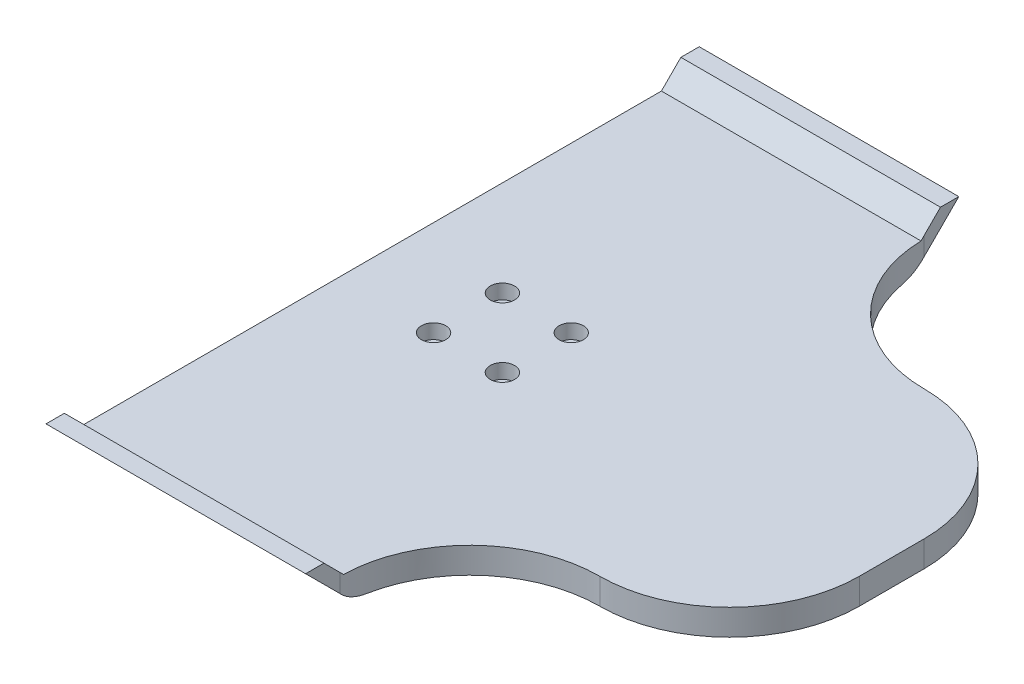
ISO-10303-21;
HEADER;
FILE_DESCRIPTION(('STEP AP214'),'2;1');
FILE_NAME('part.step','',(''),(''),'','','');
FILE_SCHEMA(('AUTOMOTIVE_DESIGN { 1 0 10303 214 1 1 1 1 }'));
ENDSEC;
DATA;
#1=APPLICATION_CONTEXT('core data for automotive mechanical design processes');
#2=APPLICATION_PROTOCOL_DEFINITION('international standard','automotive_design',2000,#1);
#3=PRODUCT_CONTEXT('',#1,'mechanical');
#4=PRODUCT('Part','Part','',(#3));
#5=PRODUCT_RELATED_PRODUCT_CATEGORY('part','',(#4));
#6=PRODUCT_DEFINITION_FORMATION('','',#4);
#7=PRODUCT_DEFINITION_CONTEXT('part definition',#1,'design');
#8=PRODUCT_DEFINITION('design','',#6,#7);
#9=PRODUCT_DEFINITION_SHAPE('','',#8);
#10=(LENGTH_UNIT() NAMED_UNIT(*) SI_UNIT(.MILLI.,.METRE.));
#11=(NAMED_UNIT(*) PLANE_ANGLE_UNIT() SI_UNIT($,.RADIAN.));
#12=(NAMED_UNIT(*) SI_UNIT($,.STERADIAN.) SOLID_ANGLE_UNIT());
#13=UNCERTAINTY_MEASURE_WITH_UNIT(LENGTH_MEASURE(1.E-05),#10,'distance_accuracy_value','');
#14=(GEOMETRIC_REPRESENTATION_CONTEXT(3) GLOBAL_UNCERTAINTY_ASSIGNED_CONTEXT((#13)) GLOBAL_UNIT_ASSIGNED_CONTEXT((#10,
#11,#12)) REPRESENTATION_CONTEXT('',''));
#15=CARTESIAN_POINT('',(0.,0.,0.));
#16=DIRECTION('',(0.,0.,1.));
#17=DIRECTION('',(1.,0.,0.));
#18=AXIS2_PLACEMENT_3D('',#15,#16,#17);
#19=CARTESIAN_POINT('',(40.,0.,0.));
#20=DIRECTION('',(1.,0.,0.));
#21=DIRECTION('',(0.,0.,-1.));
#22=AXIS2_PLACEMENT_3D('',#19,#20,#21);
#23=PLANE('',#22);
#24=DIRECTION('',(0.,0.,-1.));
#25=VECTOR('',#24,1.);
#26=CARTESIAN_POINT('',(40.,6.,107.156854249492));
#27=LINE('',#26,#25);
#28=CARTESIAN_POINT('',(40.,6.,100.656854249492));
#29=VERTEX_POINT('',#28);
#30=CARTESIAN_POINT('',(40.,6.,95.0000000000002));
#31=VERTEX_POINT('',#30);
#32=EDGE_CURVE('E266',#29,#31,#27,.T.);
#33=ORIENTED_EDGE('',*,*,#32,.F.);
#34=DIRECTION('',(0.,-0.707106781186548,-0.707106781186547));
#35=VECTOR('',#34,1.);
#36=CARTESIAN_POINT('',(40.,-47.3284271247462,47.3284271247463));
#37=LINE('',#36,#35);
#38=CARTESIAN_POINT('',(40.,-4.65685424949248,90.));
#39=VERTEX_POINT('',#38);
#40=EDGE_CURVE('E158',#29,#39,#37,.T.);
#41=ORIENTED_EDGE('',*,*,#40,.T.);
#42=DIRECTION('',(0.,-1.,0.));
#43=VECTOR('',#42,1.);
#44=CARTESIAN_POINT('',(40.,0.,90.));
#45=LINE('',#44,#43);
#46=CARTESIAN_POINT('',(40.,0.999999999999893,90.));
#47=VERTEX_POINT('',#46);
#48=EDGE_CURVE('E351',#39,#47,#45,.F.);
#49=ORIENTED_EDGE('',*,*,#48,.T.);
#50=DIRECTION('',(0.,0.707106781186544,0.707106781186551));
#51=VECTOR('',#50,1.);
#52=CARTESIAN_POINT('',(40.,0.,89.0000000000001));
#53=LINE('',#52,#51);
#54=EDGE_CURVE('E320',#47,#31,#53,.T.);
#55=ORIENTED_EDGE('',*,*,#54,.T.);
#56=EDGE_LOOP('',(#33,#41,#49,#55));
#57=FACE_BOUND('',#56,.T.);
#58=ADVANCED_FACE('F40',(#57),#23,.T.);
#59=CARTESIAN_POINT('',(40.,-8.,92.3137084989848));
#60=DIRECTION('',(0.,1.,0.));
#61=DIRECTION('',(0.,0.,1.));
#62=AXIS2_PLACEMENT_3D('',#59,#60,#61);
#63=PLANE('',#62);
#64=CARTESIAN_POINT('',(-10.6066017177982,-8.,-10.6066017177982));
#65=DIRECTION('',(0.,1.,0.));
#66=DIRECTION('',(0.,0.,1.));
#67=AXIS2_PLACEMENT_3D('',#64,#65,#66);
#68=CIRCLE('',#67,2.2);
#69=CARTESIAN_POINT('',(-10.6066017177982,-8.,-8.40660171779821));
#70=VERTEX_POINT('',#69);
#71=EDGE_CURVE('E300',#70,#70,#68,.T.);
#72=ORIENTED_EDGE('',*,*,#71,.T.);
#73=EDGE_LOOP('',(#72));
#74=FACE_BOUND('',#73,.T.);
#75=CARTESIAN_POINT('',(10.6066017177982,-8.,-10.6066017177982));
#76=DIRECTION('',(0.,1.,0.));
#77=DIRECTION('',(0.,0.,1.));
#78=AXIS2_PLACEMENT_3D('',#75,#76,#77);
#79=CIRCLE('',#78,2.2);
#80=CARTESIAN_POINT('',(10.6066017177982,-8.,-8.40660171779821));
#81=VERTEX_POINT('',#80);
#82=EDGE_CURVE('E297',#81,#81,#79,.T.);
#83=ORIENTED_EDGE('',*,*,#82,.T.);
#84=EDGE_LOOP('',(#83));
#85=FACE_BOUND('',#84,.T.);
#86=CARTESIAN_POINT('',(10.6066017177982,-8.,10.6066017177982));
#87=DIRECTION('',(0.,1.,0.));
#88=DIRECTION('',(0.,0.,1.));
#89=AXIS2_PLACEMENT_3D('',#86,#87,#88);
#90=CIRCLE('',#89,2.2);
#91=CARTESIAN_POINT('',(10.6066017177982,-8.,12.8066017177982));
#92=VERTEX_POINT('',#91);
#93=EDGE_CURVE('E301',#92,#92,#90,.T.);
#94=ORIENTED_EDGE('',*,*,#93,.T.);
#95=EDGE_LOOP('',(#94));
#96=FACE_BOUND('',#95,.T.);
#97=CARTESIAN_POINT('',(-10.6066017177982,-8.,10.6066017177982));
#98=DIRECTION('',(0.,1.,0.));
#99=DIRECTION('',(0.,0.,1.));
#100=AXIS2_PLACEMENT_3D('',#97,#98,#99);
#101=CIRCLE('',#100,2.2);
#102=CARTESIAN_POINT('',(-10.6066017177982,-8.,12.8066017177982));
#103=VERTEX_POINT('',#102);
#104=EDGE_CURVE('E304',#103,#103,#101,.T.);
#105=ORIENTED_EDGE('',*,*,#104,.T.);
#106=EDGE_LOOP('',(#105));
#107=FACE_BOUND('',#106,.T.);
#108=CARTESIAN_POINT('',(80.,-8.,90.));
#109=DIRECTION('',(0.,1.,0.));
#110=DIRECTION('',(0.,0.,1.));
#111=AXIS2_PLACEMENT_3D('',#108,#109,#110);
#112=CIRCLE('',#111,40.);
#113=CARTESIAN_POINT('',(80.,-8.,50.));
#114=VERTEX_POINT('',#113);
#115=CARTESIAN_POINT('',(40.7066091721715,-8.,82.5147186257615));
#116=VERTEX_POINT('',#115);
#117=EDGE_CURVE('E361',#114,#116,#112,.T.);
#118=ORIENTED_EDGE('',*,*,#117,.T.);
#119=DIRECTION('',(1.,0.,0.));
#120=VECTOR('',#119,1.);
#121=CARTESIAN_POINT('',(-40.,-8.,82.5147186257615));
#122=LINE('',#121,#120);
#123=CARTESIAN_POINT('',(-40.,-8.,82.5147186257615));
#124=VERTEX_POINT('',#123);
#125=EDGE_CURVE('E445',#116,#124,#122,.F.);
#126=ORIENTED_EDGE('',*,*,#125,.T.);
#127=DIRECTION('',(0.,0.,-1.));
#128=VECTOR('',#127,1.);
#129=CARTESIAN_POINT('',(-40.,-8.,92.3137084989848));
#130=LINE('',#129,#128);
#131=CARTESIAN_POINT('',(-40.,-8.,-82.5147186257615));
#132=VERTEX_POINT('',#131);
#133=EDGE_CURVE('E317',#124,#132,#130,.T.);
#134=ORIENTED_EDGE('',*,*,#133,.T.);
#135=DIRECTION('',(1.,0.,0.));
#136=VECTOR('',#135,1.);
#137=CARTESIAN_POINT('',(40.,-8.,-82.5147186257615));
#138=LINE('',#137,#136);
#139=CARTESIAN_POINT('',(40.7066091721715,-8.,-82.5147186257615));
#140=VERTEX_POINT('',#139);
#141=EDGE_CURVE('E194',#132,#140,#138,.T.);
#142=ORIENTED_EDGE('',*,*,#141,.T.);
#143=CARTESIAN_POINT('',(80.,-8.,-90.));
#144=DIRECTION('',(0.,1.,0.));
#145=DIRECTION('',(0.,0.,1.));
#146=AXIS2_PLACEMENT_3D('',#143,#144,#145);
#147=CIRCLE('',#146,40.);
#148=CARTESIAN_POINT('',(80.,-8.,-50.));
#149=VERTEX_POINT('',#148);
#150=EDGE_CURVE('E359',#140,#149,#147,.T.);
#151=ORIENTED_EDGE('',*,*,#150,.T.);
#152=CARTESIAN_POINT('',(80.,-8.,-9.99999999999999));
#153=DIRECTION('',(0.,1.,0.));
#154=DIRECTION('',(0.,0.,1.));
#155=AXIS2_PLACEMENT_3D('',#152,#153,#154);
#156=CIRCLE('',#155,40.);
#157=CARTESIAN_POINT('',(120.,-8.,-9.99999999999999));
#158=VERTEX_POINT('',#157);
#159=EDGE_CURVE('E348',#149,#158,#156,.F.);
#160=ORIENTED_EDGE('',*,*,#159,.T.);
#161=DIRECTION('',(0.,0.,-1.));
#162=VECTOR('',#161,1.);
#163=CARTESIAN_POINT('',(120.,-8.,-50.));
#164=LINE('',#163,#162);
#165=CARTESIAN_POINT('',(120.,-8.,10.));
#166=VERTEX_POINT('',#165);
#167=EDGE_CURVE('E310',#166,#158,#164,.T.);
#168=ORIENTED_EDGE('',*,*,#167,.F.);
#169=CARTESIAN_POINT('',(80.,-8.,10.));
#170=DIRECTION('',(0.,1.,0.));
#171=DIRECTION('',(0.,0.,1.));
#172=AXIS2_PLACEMENT_3D('',#169,#170,#171);
#173=CIRCLE('',#172,40.);
#174=EDGE_CURVE('E346',#166,#114,#173,.F.);
#175=ORIENTED_EDGE('',*,*,#174,.T.);
#176=EDGE_LOOP('',(#118,#126,#134,#142,#151,#160,#168,#175));
#177=FACE_BOUND('',#176,.T.);
#178=ADVANCED_FACE('F223',(#74,#85,#96,#107,#177),#63,.F.);
#179=CARTESIAN_POINT('',(-40.,0.,0.));
#180=DIRECTION('',(1.,0.,0.));
#181=DIRECTION('',(0.,0.,-1.));
#182=AXIS2_PLACEMENT_3D('',#179,#180,#181);
#183=PLANE('',#182);
#184=ORIENTED_EDGE('',*,*,#133,.F.);
#185=CARTESIAN_POINT('',(-40.,2.,82.5147186257615));
#186=DIRECTION('',(1.,0.,0.));
#187=DIRECTION('',(0.,0.,-1.));
#188=AXIS2_PLACEMENT_3D('',#185,#186,#187);
#189=CIRCLE('',#188,10.);
#190=CARTESIAN_POINT('',(-40.,-5.07106781186546,89.585786437627));
#191=VERTEX_POINT('',#190);
#192=EDGE_CURVE('E171',#124,#191,#189,.F.);
#193=ORIENTED_EDGE('',*,*,#192,.T.);
#194=DIRECTION('',(0.,-0.707106781186548,-0.707106781186547));
#195=VECTOR('',#194,1.);
#196=CARTESIAN_POINT('',(-40.,6.,100.656854249492));
#197=LINE('',#196,#195);
#198=CARTESIAN_POINT('',(-40.,6.,100.656854249492));
#199=VERTEX_POINT('',#198);
#200=EDGE_CURVE('E155',#199,#191,#197,.T.);
#201=ORIENTED_EDGE('',*,*,#200,.F.);
#202=DIRECTION('',(0.,0.,-1.));
#203=VECTOR('',#202,1.);
#204=CARTESIAN_POINT('',(-40.,6.,0.));
#205=LINE('',#204,#203);
#206=CARTESIAN_POINT('',(-40.,6.,95.0000000000002));
#207=VERTEX_POINT('',#206);
#208=EDGE_CURVE('E168',#199,#207,#205,.T.);
#209=ORIENTED_EDGE('',*,*,#208,.T.);
#210=DIRECTION('',(0.,0.707106781186544,0.707106781186551));
#211=VECTOR('',#210,1.);
#212=CARTESIAN_POINT('',(-40.,0.,89.0000000000001));
#213=LINE('',#212,#211);
#214=CARTESIAN_POINT('',(-40.,0.,89.0000000000001));
#215=VERTEX_POINT('',#214);
#216=EDGE_CURVE('E321',#215,#207,#213,.T.);
#217=ORIENTED_EDGE('',*,*,#216,.F.);
#218=DIRECTION('',(0.,0.,1.));
#219=VECTOR('',#218,1.);
#220=CARTESIAN_POINT('',(-40.,0.,89.0000000000001));
#221=LINE('',#220,#219);
#222=CARTESIAN_POINT('',(-40.,0.,-89.0000000000001));
#223=VERTEX_POINT('',#222);
#224=EDGE_CURVE('E329',#223,#215,#221,.T.);
#225=ORIENTED_EDGE('',*,*,#224,.F.);
#226=DIRECTION('',(0.,-0.707106781186549,0.707106781186546));
#227=VECTOR('',#226,1.);
#228=CARTESIAN_POINT('',(-40.,0.,-89.0000000000001));
#229=LINE('',#228,#227);
#230=CARTESIAN_POINT('',(-40.,6.,-95.0000000000001));
#231=VERTEX_POINT('',#230);
#232=EDGE_CURVE('E327',#231,#223,#229,.T.);
#233=ORIENTED_EDGE('',*,*,#232,.F.);
#234=CARTESIAN_POINT('',(-40.,6.,-100.656854249492));
#235=VERTEX_POINT('',#234);
#236=EDGE_CURVE('E178',#231,#235,#205,.T.);
#237=ORIENTED_EDGE('',*,*,#236,.T.);
#238=DIRECTION('',(0.,-0.707106781186548,0.707106781186547));
#239=VECTOR('',#238,1.);
#240=CARTESIAN_POINT('',(-40.,6.,-100.656854249492));
#241=LINE('',#240,#239);
#242=CARTESIAN_POINT('',(-40.,-5.07106781186546,-89.585786437627));
#243=VERTEX_POINT('',#242);
#244=EDGE_CURVE('E473',#235,#243,#241,.T.);
#245=ORIENTED_EDGE('',*,*,#244,.T.);
#246=CARTESIAN_POINT('',(-40.,2.,-82.5147186257615));
#247=DIRECTION('',(1.,0.,0.));
#248=DIRECTION('',(0.,0.,-1.));
#249=AXIS2_PLACEMENT_3D('',#246,#247,#248);
#250=CIRCLE('',#249,10.);
#251=EDGE_CURVE('E446',#243,#132,#250,.F.);
#252=ORIENTED_EDGE('',*,*,#251,.T.);
#253=EDGE_LOOP('',(#184,#193,#201,#209,#217,#225,#233,#237,#245,#252));
#254=FACE_BOUND('',#253,.T.);
#255=ADVANCED_FACE('F166',(#254),#183,.F.);
#256=CARTESIAN_POINT('',(80.,0.,90.));
#257=DIRECTION('',(0.,-1.,0.));
#258=DIRECTION('',(0.,0.,-1.));
#259=AXIS2_PLACEMENT_3D('',#256,#257,#258);
#260=CYLINDRICAL_SURFACE('',#259,40.);
#261=CARTESIAN_POINT('',(80.,-4.65685424949248,90.));
#262=DIRECTION('',(0.,-0.707106781186547,0.707106781186548));
#263=DIRECTION('',(0.,-0.707106781186548,-0.707106781186547));
#264=AXIS2_PLACEMENT_3D('',#261,#262,#263);
#265=ELLIPSE('',#264,56.5685424949238,40.);
#266=CARTESIAN_POINT('',(40.0021447184384,-5.07106781186546,89.585786437627));
#267=VERTEX_POINT('',#266);
#268=EDGE_CURVE('E162',#267,#39,#265,.F.);
#269=ORIENTED_EDGE('',*,*,#268,.F.);
#270=CARTESIAN_POINT('',(40.0021447184384,-5.07106781186546,89.585786437627));
#271=CARTESIAN_POINT('',(40.0041586859841,-5.26634212881536,89.3905574940038));
#272=CARTESIAN_POINT('',(40.0077012243591,-5.45347968856096,89.1872021111515));
#273=CARTESIAN_POINT('',(40.0184925640982,-5.8102756625916,88.7657707465181));
#274=CARTESIAN_POINT('',(40.0257415487148,-5.97993321213819,88.5476940373535));
#275=CARTESIAN_POINT('',(40.0445963198971,-6.3005692951608,88.0983364379006));
#276=CARTESIAN_POINT('',(40.0562027942129,-6.45154487502521,87.8670534681338));
#277=CARTESIAN_POINT('',(40.0843378978113,-6.73373285821434,87.3930352403398));
#278=CARTESIAN_POINT('',(40.1008661841382,-6.86494663759767,87.1503007812526));
#279=CARTESIAN_POINT('',(40.1393422947468,-7.10686861441198,86.6548903781081));
#280=CARTESIAN_POINT('',(40.1612962108379,-7.21755351613449,86.4022035296038));
#281=CARTESIAN_POINT('',(40.2109749097812,-7.41752213369764,85.8890486138794));
#282=CARTESIAN_POINT('',(40.2386996771802,-7.50680590684414,85.6285805674973));
#283=CARTESIAN_POINT('',(40.3001007104158,-7.66333417793151,85.102236279326));
#284=CARTESIAN_POINT('',(40.3337677878594,-7.73061225077905,84.8363689400022));
#285=CARTESIAN_POINT('',(40.4071542757666,-7.84298175184591,84.3009166341648));
#286=CARTESIAN_POINT('',(40.4468710784468,-7.88808270444527,84.0313333147768));
#287=CARTESIAN_POINT('',(40.5223237729934,-7.94809396068859,83.5535175972443));
#288=CARTESIAN_POINT('',(40.5568249669723,-7.96759401740613,83.3456526923086));
#289=CARTESIAN_POINT('',(40.6292029766075,-7.99354212480495,82.9299963827981));
#290=CARTESIAN_POINT('',(40.6670749957427,-8.00000842141069,82.7222052831815));
#291=CARTESIAN_POINT('',(40.7066091721715,-8.,82.5147186257615));
#292=B_SPLINE_CURVE_WITH_KNOTS('',3,(#270,#271,#272,#273,#274,#275,#276,#277,#278,#279,#280,
#281,#282,#283,#284,#285,#286,#287,#288,#289,#290,#291),.UNSPECIFIED.,.F.,.F.,(4,2,2,2,2,2,2,2,
2,2,4),(0.,0.828168374274392,1.65637769849803,2.48471779542649,3.31300018647703,
4.14221681865408,4.97143123041133,5.79937451276098,6.62696190811035,7.26137634256889,
7.89490204349188),.UNSPECIFIED.);
#293=EDGE_CURVE('E180',#267,#116,#292,.T.);
#294=ORIENTED_EDGE('',*,*,#293,.T.);
#295=ORIENTED_EDGE('',*,*,#117,.F.);
#296=DIRECTION('',(0.,-1.,0.));
#297=VECTOR('',#296,1.);
#298=CARTESIAN_POINT('',(80.,0.,50.));
#299=LINE('',#298,#297);
#300=CARTESIAN_POINT('',(80.,0.,50.));
#301=VERTEX_POINT('',#300);
#302=EDGE_CURVE('E309',#114,#301,#299,.F.);
#303=ORIENTED_EDGE('',*,*,#302,.T.);
#304=CARTESIAN_POINT('',(80.,0.,90.));
#305=DIRECTION('',(0.,-1.,0.));
#306=DIRECTION('',(0.,0.,-1.));
#307=AXIS2_PLACEMENT_3D('',#304,#305,#306);
#308=CIRCLE('',#307,40.);
#309=CARTESIAN_POINT('',(40.0125019537356,0.,89.0000000000001));
#310=VERTEX_POINT('',#309);
#311=EDGE_CURVE('E183',#310,#301,#308,.T.);
#312=ORIENTED_EDGE('',*,*,#311,.F.);
#313=CARTESIAN_POINT('',(80.,0.999999999999893,90.));
#314=DIRECTION('',(0.,-0.707106781186551,0.707106781186544));
#315=DIRECTION('',(0.,-0.707106781186544,-0.707106781186551));
#316=AXIS2_PLACEMENT_3D('',#313,#314,#315);
#317=ELLIPSE('',#316,56.5685424949235,40.);
#318=EDGE_CURVE('E364',#47,#310,#317,.T.);
#319=ORIENTED_EDGE('',*,*,#318,.F.);
#320=ORIENTED_EDGE('',*,*,#48,.F.);
#321=EDGE_LOOP('',(#269,#294,#295,#303,#312,#319,#320));
#322=FACE_BOUND('',#321,.T.);
#323=ADVANCED_FACE('F199',(#322),#260,.F.);
#324=CARTESIAN_POINT('',(0.,6.,0.));
#325=DIRECTION('',(0.,-1.,0.));
#326=DIRECTION('',(0.,0.,-1.));
#327=AXIS2_PLACEMENT_3D('',#324,#325,#326);
#328=PLANE('',#327);
#329=DIRECTION('',(1.,0.,0.));
#330=VECTOR('',#329,1.);
#331=CARTESIAN_POINT('',(-40.,6.,100.656854249492));
#332=LINE('',#331,#330);
#333=EDGE_CURVE('E151',#199,#29,#332,.T.);
#334=ORIENTED_EDGE('',*,*,#333,.T.);
#335=ORIENTED_EDGE('',*,*,#32,.T.);
#336=DIRECTION('',(1.,0.,0.));
#337=VECTOR('',#336,1.);
#338=CARTESIAN_POINT('',(40.,6.,95.0000000000002));
#339=LINE('',#338,#337);
#340=EDGE_CURVE('E175',#207,#31,#339,.T.);
#341=ORIENTED_EDGE('',*,*,#340,.F.);
#342=ORIENTED_EDGE('',*,*,#208,.F.);
#343=EDGE_LOOP('',(#334,#335,#341,#342));
#344=FACE_BOUND('',#343,.T.);
#345=ADVANCED_FACE('F173',(#344),#328,.F.);
#346=CARTESIAN_POINT('',(-10.6066017177982,-8.,-10.6066017177982));
#347=DIRECTION('',(0.,1.,0.));
#348=DIRECTION('',(0.,0.,1.));
#349=AXIS2_PLACEMENT_3D('',#346,#347,#348);
#350=CYLINDRICAL_SURFACE('',#349,2.2);
#351=ORIENTED_EDGE('',*,*,#71,.F.);
#352=EDGE_LOOP('',(#351));
#353=FACE_BOUND('',#352,.T.);
#354=CARTESIAN_POINT('',(-10.6066017177982,-4.5,-10.6066017177982));
#355=DIRECTION('',(0.,1.,0.));
#356=DIRECTION('',(0.,0.,1.));
#357=AXIS2_PLACEMENT_3D('',#354,#355,#356);
#358=CIRCLE('',#357,2.2);
#359=CARTESIAN_POINT('',(-10.6066017177982,-4.5,-8.40660171779821));
#360=VERTEX_POINT('',#359);
#361=EDGE_CURVE('E185',#360,#360,#358,.F.);
#362=ORIENTED_EDGE('',*,*,#361,.F.);
#363=EDGE_LOOP('',(#362));
#364=FACE_BOUND('',#363,.T.);
#365=ADVANCED_FACE('F385',(#353,#364),#350,.F.);
#366=CARTESIAN_POINT('',(10.6066017177982,-8.,-10.6066017177982));
#367=DIRECTION('',(0.,1.,0.));
#368=DIRECTION('',(0.,0.,1.));
#369=AXIS2_PLACEMENT_3D('',#366,#367,#368);
#370=CYLINDRICAL_SURFACE('',#369,2.2);
#371=ORIENTED_EDGE('',*,*,#82,.F.);
#372=EDGE_LOOP('',(#371));
#373=FACE_BOUND('',#372,.T.);
#374=CARTESIAN_POINT('',(10.6066017177982,-4.5,-10.6066017177982));
#375=DIRECTION('',(0.,1.,0.));
#376=DIRECTION('',(0.,0.,1.));
#377=AXIS2_PLACEMENT_3D('',#374,#375,#376);
#378=CIRCLE('',#377,2.2);
#379=CARTESIAN_POINT('',(10.6066017177982,-4.5,-8.40660171779821));
#380=VERTEX_POINT('',#379);
#381=EDGE_CURVE('E376',#380,#380,#378,.F.);
#382=ORIENTED_EDGE('',*,*,#381,.F.);
#383=EDGE_LOOP('',(#382));
#384=FACE_BOUND('',#383,.T.);
#385=ADVANCED_FACE('F386',(#373,#384),#370,.F.);
#386=CARTESIAN_POINT('',(10.6066017177982,-8.,10.6066017177982));
#387=DIRECTION('',(0.,1.,0.));
#388=DIRECTION('',(0.,0.,1.));
#389=AXIS2_PLACEMENT_3D('',#386,#387,#388);
#390=CYLINDRICAL_SURFACE('',#389,2.2);
#391=ORIENTED_EDGE('',*,*,#93,.F.);
#392=EDGE_LOOP('',(#391));
#393=FACE_BOUND('',#392,.T.);
#394=CARTESIAN_POINT('',(10.6066017177982,-4.5,10.6066017177982));
#395=DIRECTION('',(0.,1.,0.));
#396=DIRECTION('',(0.,0.,1.));
#397=AXIS2_PLACEMENT_3D('',#394,#395,#396);
#398=CIRCLE('',#397,2.2);
#399=CARTESIAN_POINT('',(10.6066017177982,-4.5,12.8066017177982));
#400=VERTEX_POINT('',#399);
#401=EDGE_CURVE('E374',#400,#400,#398,.F.);
#402=ORIENTED_EDGE('',*,*,#401,.F.);
#403=EDGE_LOOP('',(#402));
#404=FACE_BOUND('',#403,.T.);
#405=ADVANCED_FACE('F392',(#393,#404),#390,.F.);
#406=CARTESIAN_POINT('',(-10.6066017177982,-8.,10.6066017177982));
#407=DIRECTION('',(0.,1.,0.));
#408=DIRECTION('',(0.,0.,1.));
#409=AXIS2_PLACEMENT_3D('',#406,#407,#408);
#410=CYLINDRICAL_SURFACE('',#409,2.2);
#411=ORIENTED_EDGE('',*,*,#104,.F.);
#412=EDGE_LOOP('',(#411));
#413=FACE_BOUND('',#412,.T.);
#414=CARTESIAN_POINT('',(-10.6066017177982,-4.5,10.6066017177982));
#415=DIRECTION('',(0.,1.,0.));
#416=DIRECTION('',(0.,0.,1.));
#417=AXIS2_PLACEMENT_3D('',#414,#415,#416);
#418=CIRCLE('',#417,2.2);
#419=CARTESIAN_POINT('',(-10.6066017177982,-4.5,12.8066017177982));
#420=VERTEX_POINT('',#419);
#421=EDGE_CURVE('E294',#420,#420,#418,.F.);
#422=ORIENTED_EDGE('',*,*,#421,.F.);
#423=EDGE_LOOP('',(#422));
#424=FACE_BOUND('',#423,.T.);
#425=ADVANCED_FACE('F398',(#413,#424),#410,.F.);
#426=CARTESIAN_POINT('',(40.,0.,-89.0000000000001));
#427=DIRECTION('',(0.,-0.707106781186546,-0.707106781186549));
#428=DIRECTION('',(0.,0.707106781186549,-0.707106781186546));
#429=AXIS2_PLACEMENT_3D('',#426,#427,#428);
#430=PLANE('',#429);
#431=DIRECTION('',(0.,-0.707106781186549,0.707106781186546));
#432=VECTOR('',#431,1.);
#433=CARTESIAN_POINT('',(40.,0.,-89.0000000000001));
#434=LINE('',#433,#432);
#435=CARTESIAN_POINT('',(40.,6.,-95.0000000000001));
#436=VERTEX_POINT('',#435);
#437=CARTESIAN_POINT('',(40.,0.999999999999907,-90.));
#438=VERTEX_POINT('',#437);
#439=EDGE_CURVE('E318',#436,#438,#434,.T.);
#440=ORIENTED_EDGE('',*,*,#439,.F.);
#441=DIRECTION('',(-1.,0.,0.));
#442=VECTOR('',#441,1.);
#443=CARTESIAN_POINT('',(40.,6.,-95.0000000000001));
#444=LINE('',#443,#442);
#445=EDGE_CURVE('E265',#436,#231,#444,.T.);
#446=ORIENTED_EDGE('',*,*,#445,.T.);
#447=ORIENTED_EDGE('',*,*,#232,.T.);
#448=DIRECTION('',(-1.,0.,0.));
#449=VECTOR('',#448,1.);
#450=CARTESIAN_POINT('',(40.,0.,-89.0000000000001));
#451=LINE('',#450,#449);
#452=CARTESIAN_POINT('',(40.0125019537356,0.,-89.0000000000001));
#453=VERTEX_POINT('',#452);
#454=EDGE_CURVE('E334',#453,#223,#451,.T.);
#455=ORIENTED_EDGE('',*,*,#454,.F.);
#456=CARTESIAN_POINT('',(80.,0.999999999999907,-90.));
#457=DIRECTION('',(0.,-0.707106781186546,-0.707106781186549));
#458=DIRECTION('',(0.,0.707106781186549,-0.707106781186546));
#459=AXIS2_PLACEMENT_3D('',#456,#457,#458);
#460=ELLIPSE('',#459,56.5685424949239,40.);
#461=EDGE_CURVE('E356',#453,#438,#460,.T.);
#462=ORIENTED_EDGE('',*,*,#461,.T.);
#463=EDGE_LOOP('',(#440,#446,#447,#455,#462));
#464=FACE_BOUND('',#463,.T.);
#465=ADVANCED_FACE('F401',(#464),#430,.F.);
#466=CARTESIAN_POINT('',(40.,0.,89.0000000000001));
#467=DIRECTION('',(0.,-1.,0.));
#468=DIRECTION('',(0.,0.,-1.));
#469=AXIS2_PLACEMENT_3D('',#466,#467,#468);
#470=PLANE('',#469);
#471=CARTESIAN_POINT('',(-10.6066017177982,0.,10.6066017177982));
#472=DIRECTION('',(0.,1.,0.));
#473=DIRECTION('',(0.,0.,1.));
#474=AXIS2_PLACEMENT_3D('',#471,#472,#473);
#475=CIRCLE('',#474,3.75);
#476=CARTESIAN_POINT('',(-10.6066017177982,0.,14.3566017177982));
#477=VERTEX_POINT('',#476);
#478=EDGE_CURVE('E286',#477,#477,#475,.T.);
#479=ORIENTED_EDGE('',*,*,#478,.F.);
#480=EDGE_LOOP('',(#479));
#481=FACE_BOUND('',#480,.T.);
#482=CARTESIAN_POINT('',(10.6066017177982,0.,10.6066017177982));
#483=DIRECTION('',(0.,1.,0.));
#484=DIRECTION('',(0.,0.,1.));
#485=AXIS2_PLACEMENT_3D('',#482,#483,#484);
#486=CIRCLE('',#485,3.75);
#487=CARTESIAN_POINT('',(10.6066017177982,0.,14.3566017177982));
#488=VERTEX_POINT('',#487);
#489=EDGE_CURVE('E280',#488,#488,#486,.T.);
#490=ORIENTED_EDGE('',*,*,#489,.F.);
#491=EDGE_LOOP('',(#490));
#492=FACE_BOUND('',#491,.T.);
#493=CARTESIAN_POINT('',(10.6066017177982,0.,-10.6066017177982));
#494=DIRECTION('',(0.,1.,0.));
#495=DIRECTION('',(0.,0.,1.));
#496=AXIS2_PLACEMENT_3D('',#493,#494,#495);
#497=CIRCLE('',#496,3.75);
#498=CARTESIAN_POINT('',(10.6066017177982,0.,-6.85660171779821));
#499=VERTEX_POINT('',#498);
#500=EDGE_CURVE('E273',#499,#499,#497,.T.);
#501=ORIENTED_EDGE('',*,*,#500,.F.);
#502=EDGE_LOOP('',(#501));
#503=FACE_BOUND('',#502,.T.);
#504=CARTESIAN_POINT('',(-10.6066017177982,0.,-10.6066017177982));
#505=DIRECTION('',(0.,1.,0.));
#506=DIRECTION('',(0.,0.,1.));
#507=AXIS2_PLACEMENT_3D('',#504,#505,#506);
#508=CIRCLE('',#507,3.75);
#509=CARTESIAN_POINT('',(-10.6066017177982,0.,-6.85660171779821));
#510=VERTEX_POINT('',#509);
#511=EDGE_CURVE('E276',#510,#510,#508,.T.);
#512=ORIENTED_EDGE('',*,*,#511,.F.);
#513=EDGE_LOOP('',(#512));
#514=FACE_BOUND('',#513,.T.);
#515=DIRECTION('',(0.,0.,1.));
#516=VECTOR('',#515,1.);
#517=CARTESIAN_POINT('',(120.,0.,-50.));
#518=LINE('',#517,#516);
#519=CARTESIAN_POINT('',(120.,0.,-9.99999999999999));
#520=VERTEX_POINT('',#519);
#521=CARTESIAN_POINT('',(120.,0.,10.));
#522=VERTEX_POINT('',#521);
#523=EDGE_CURVE('E313',#520,#522,#518,.T.);
#524=ORIENTED_EDGE('',*,*,#523,.F.);
#525=CARTESIAN_POINT('',(80.,0.,-9.99999999999999));
#526=DIRECTION('',(0.,-1.,0.));
#527=DIRECTION('',(0.,0.,-1.));
#528=AXIS2_PLACEMENT_3D('',#525,#526,#527);
#529=CIRCLE('',#528,40.);
#530=CARTESIAN_POINT('',(80.,0.,-50.));
#531=VERTEX_POINT('',#530);
#532=EDGE_CURVE('E344',#520,#531,#529,.F.);
#533=ORIENTED_EDGE('',*,*,#532,.T.);
#534=CARTESIAN_POINT('',(80.,0.,-90.));
#535=DIRECTION('',(0.,-1.,0.));
#536=DIRECTION('',(0.,0.,-1.));
#537=AXIS2_PLACEMENT_3D('',#534,#535,#536);
#538=CIRCLE('',#537,40.);
#539=EDGE_CURVE('E353',#531,#453,#538,.T.);
#540=ORIENTED_EDGE('',*,*,#539,.T.);
#541=ORIENTED_EDGE('',*,*,#454,.T.);
#542=ORIENTED_EDGE('',*,*,#224,.T.);
#543=DIRECTION('',(-1.,0.,0.));
#544=VECTOR('',#543,1.);
#545=CARTESIAN_POINT('',(40.,0.,89.0000000000001));
#546=LINE('',#545,#544);
#547=EDGE_CURVE('E324',#310,#215,#546,.T.);
#548=ORIENTED_EDGE('',*,*,#547,.F.);
#549=ORIENTED_EDGE('',*,*,#311,.T.);
#550=CARTESIAN_POINT('',(80.,0.,10.));
#551=DIRECTION('',(0.,-1.,0.));
#552=DIRECTION('',(0.,0.,-1.));
#553=AXIS2_PLACEMENT_3D('',#550,#551,#552);
#554=CIRCLE('',#553,40.);
#555=EDGE_CURVE('E342',#301,#522,#554,.F.);
#556=ORIENTED_EDGE('',*,*,#555,.T.);
#557=EDGE_LOOP('',(#524,#533,#540,#541,#542,#548,#549,#556));
#558=FACE_BOUND('',#557,.T.);
#559=ADVANCED_FACE('F245',(#481,#492,#503,#514,#558),#470,.F.);
#560=CARTESIAN_POINT('',(40.,0.,89.0000000000001));
#561=DIRECTION('',(0.,-0.707106781186551,0.707106781186544));
#562=DIRECTION('',(0.,-0.707106781186544,-0.707106781186551));
#563=AXIS2_PLACEMENT_3D('',#560,#561,#562);
#564=PLANE('',#563);
#565=ORIENTED_EDGE('',*,*,#216,.T.);
#566=ORIENTED_EDGE('',*,*,#340,.T.);
#567=ORIENTED_EDGE('',*,*,#54,.F.);
#568=ORIENTED_EDGE('',*,*,#318,.T.);
#569=ORIENTED_EDGE('',*,*,#547,.T.);
#570=EDGE_LOOP('',(#565,#566,#567,#568,#569));
#571=FACE_BOUND('',#570,.T.);
#572=ADVANCED_FACE('F238',(#571),#564,.F.);
#573=DIRECTION('',(0.,-0.707106781186548,0.707106781186547));
#574=VECTOR('',#573,1.);
#575=CARTESIAN_POINT('',(40.,-47.3284271247462,-47.3284271247463));
#576=LINE('',#575,#574);
#577=CARTESIAN_POINT('',(40.,6.,-100.656854249492));
#578=VERTEX_POINT('',#577);
#579=CARTESIAN_POINT('',(40.,-4.65685424949249,-90.));
#580=VERTEX_POINT('',#579);
#581=EDGE_CURVE('E252',#578,#580,#576,.T.);
#582=ORIENTED_EDGE('',*,*,#581,.F.);
#583=EDGE_CURVE('E254',#436,#578,#27,.T.);
#584=ORIENTED_EDGE('',*,*,#583,.F.);
#585=ORIENTED_EDGE('',*,*,#439,.T.);
#586=DIRECTION('',(0.,1.,0.));
#587=VECTOR('',#586,1.);
#588=CARTESIAN_POINT('',(40.,0.,-90.));
#589=LINE('',#588,#587);
#590=EDGE_CURVE('E257',#438,#580,#589,.F.);
#591=ORIENTED_EDGE('',*,*,#590,.T.);
#592=EDGE_LOOP('',(#582,#584,#585,#591));
#593=FACE_BOUND('',#592,.T.);
#594=ADVANCED_FACE('F226',(#593),#23,.T.);
#595=CARTESIAN_POINT('',(120.,0.,0.));
#596=DIRECTION('',(-1.,0.,0.));
#597=DIRECTION('',(0.,0.,1.));
#598=AXIS2_PLACEMENT_3D('',#595,#596,#597);
#599=PLANE('',#598);
#600=ORIENTED_EDGE('',*,*,#167,.T.);
#601=DIRECTION('',(0.,1.,0.));
#602=VECTOR('',#601,1.);
#603=CARTESIAN_POINT('',(120.,0.,-9.99999999999999));
#604=LINE('',#603,#602);
#605=EDGE_CURVE('E339',#158,#520,#604,.T.);
#606=ORIENTED_EDGE('',*,*,#605,.T.);
#607=ORIENTED_EDGE('',*,*,#523,.T.);
#608=DIRECTION('',(0.,-1.,0.));
#609=VECTOR('',#608,1.);
#610=CARTESIAN_POINT('',(120.,0.,10.));
#611=LINE('',#610,#609);
#612=EDGE_CURVE('E337',#522,#166,#611,.T.);
#613=ORIENTED_EDGE('',*,*,#612,.T.);
#614=EDGE_LOOP('',(#600,#606,#607,#613));
#615=FACE_BOUND('',#614,.T.);
#616=ADVANCED_FACE('F237',(#615),#599,.F.);
#617=CARTESIAN_POINT('',(80.,0.,-90.));
#618=DIRECTION('',(0.,1.,0.));
#619=DIRECTION('',(0.,0.,1.));
#620=AXIS2_PLACEMENT_3D('',#617,#618,#619);
#621=CYLINDRICAL_SURFACE('',#620,40.);
#622=ORIENTED_EDGE('',*,*,#150,.F.);
#623=CARTESIAN_POINT('',(40.7066091721715,-8.,-82.5147186257615));
#624=CARTESIAN_POINT('',(40.6548329360915,-8.00003319694535,-82.7863668290822));
#625=CARTESIAN_POINT('',(40.6059242791889,-7.98893199020056,-83.0585757387887));
#626=CARTESIAN_POINT('',(40.5140096473567,-7.9444261816413,-83.6021897951673));
#627=CARTESIAN_POINT('',(40.471004223183,-7.91101950048785,-83.8735948645351));
#628=CARTESIAN_POINT('',(40.3910626780758,-7.82185629061932,-84.413696441548));
#629=CARTESIAN_POINT('',(40.3541281731383,-7.76609382463873,-84.682392210206));
#630=CARTESIAN_POINT('',(40.286329642898,-7.63244214398177,-85.2149811827608));
#631=CARTESIAN_POINT('',(40.2554651034265,-7.55455480480448,-85.4788747917142));
#632=CARTESIAN_POINT('',(40.1996145671528,-7.37694763981034,-86.0002303055596));
#633=CARTESIAN_POINT('',(40.1746361190107,-7.27720009204499,-86.2576835770488));
#634=CARTESIAN_POINT('',(40.1303129418766,-7.05654580201657,-86.7638598732194));
#635=CARTESIAN_POINT('',(40.1109682043622,-6.93563909176333,-87.0125829111074));
#636=CARTESIAN_POINT('',(40.0775186624785,-6.67368537210875,-87.4990319437814));
#637=CARTESIAN_POINT('',(40.0634055224818,-6.53267090168978,-87.7367748995815));
#638=CARTESIAN_POINT('',(40.0398555198067,-6.23138261871406,-88.1998393280749));
#639=CARTESIAN_POINT('',(40.0304165921077,-6.07111734992275,-88.425166246877));
#640=CARTESIAN_POINT('',(40.017387684488,-5.77331650154195,-88.8091207119455));
#641=CARTESIAN_POINT('',(40.0129359054717,-5.6396293271279,-88.9707218287138));
#642=CARTESIAN_POINT('',(40.0060816235328,-5.36253436563496,-89.2850181758757));
#643=CARTESIAN_POINT('',(40.0036763371469,-5.2191400690327,-89.4377252388332));
#644=CARTESIAN_POINT('',(40.0021447184384,-5.07106781186547,-89.585786437627));
#645=B_SPLINE_CURVE_WITH_KNOTS('',3,(#623,#624,#625,#626,#627,#628,#629,#630,#631,#632,#633,
#634,#635,#636,#637,#638,#639,#640,#641,#642,#643,#644),.UNSPECIFIED.,.F.,.F.,(4,2,2,2,2,2,2,2,
2,2,4),(0.,0.82939788125148,1.65887309061211,2.48856873868414,3.31819407542398,4.14887765015865,
4.97955996823589,5.80891299297354,6.63789929020025,7.26682807343076,7.89490006815419),.UNSPECIFIED.);
#646=CARTESIAN_POINT('',(40.0021447184384,-5.07106781186547,-89.585786437627));
#647=VERTEX_POINT('',#646);
#648=EDGE_CURVE('E49',#140,#647,#645,.T.);
#649=ORIENTED_EDGE('',*,*,#648,.T.);
#650=CARTESIAN_POINT('',(80.,-4.65685424949249,-90.));
#651=DIRECTION('',(0.,0.707106781186547,0.707106781186548));
#652=DIRECTION('',(0.,0.707106781186548,-0.707106781186547));
#653=AXIS2_PLACEMENT_3D('',#650,#651,#652);
#654=ELLIPSE('',#653,56.5685424949239,40.);
#655=EDGE_CURVE('E258',#647,#580,#654,.F.);
#656=ORIENTED_EDGE('',*,*,#655,.T.);
#657=ORIENTED_EDGE('',*,*,#590,.F.);
#658=ORIENTED_EDGE('',*,*,#461,.F.);
#659=ORIENTED_EDGE('',*,*,#539,.F.);
#660=DIRECTION('',(0.,1.,0.));
#661=VECTOR('',#660,1.);
#662=CARTESIAN_POINT('',(80.,0.,-50.));
#663=LINE('',#662,#661);
#664=EDGE_CURVE('E314',#149,#531,#663,.T.);
#665=ORIENTED_EDGE('',*,*,#664,.F.);
#666=EDGE_LOOP('',(#622,#649,#656,#657,#658,#659,#665));
#667=FACE_BOUND('',#666,.T.);
#668=ADVANCED_FACE('F204',(#667),#621,.F.);
#669=CARTESIAN_POINT('',(80.,0.,-9.99999999999999));
#670=DIRECTION('',(0.,1.,0.));
#671=DIRECTION('',(0.,0.,1.));
#672=AXIS2_PLACEMENT_3D('',#669,#670,#671);
#673=CYLINDRICAL_SURFACE('',#672,40.);
#674=ORIENTED_EDGE('',*,*,#159,.F.);
#675=ORIENTED_EDGE('',*,*,#664,.T.);
#676=ORIENTED_EDGE('',*,*,#532,.F.);
#677=ORIENTED_EDGE('',*,*,#605,.F.);
#678=EDGE_LOOP('',(#674,#675,#676,#677));
#679=FACE_BOUND('',#678,.T.);
#680=ADVANCED_FACE('F210',(#679),#673,.T.);
#681=CARTESIAN_POINT('',(80.,0.,10.));
#682=DIRECTION('',(0.,-1.,0.));
#683=DIRECTION('',(0.,0.,-1.));
#684=AXIS2_PLACEMENT_3D('',#681,#682,#683);
#685=CYLINDRICAL_SURFACE('',#684,40.);
#686=ORIENTED_EDGE('',*,*,#612,.F.);
#687=ORIENTED_EDGE('',*,*,#555,.F.);
#688=ORIENTED_EDGE('',*,*,#302,.F.);
#689=ORIENTED_EDGE('',*,*,#174,.F.);
#690=EDGE_LOOP('',(#686,#687,#688,#689));
#691=FACE_BOUND('',#690,.T.);
#692=ADVANCED_FACE('F207',(#691),#685,.T.);
#693=CARTESIAN_POINT('',(-10.6066017177982,-4.5,10.6066017177982));
#694=DIRECTION('',(0.,1.,0.));
#695=DIRECTION('',(0.,0.,1.));
#696=AXIS2_PLACEMENT_3D('',#693,#694,#695);
#697=PLANE('',#696);
#698=CARTESIAN_POINT('',(-10.6066017177982,-4.5,10.6066017177982));
#699=DIRECTION('',(0.,1.,0.));
#700=DIRECTION('',(0.,0.,1.));
#701=AXIS2_PLACEMENT_3D('',#698,#699,#700);
#702=CIRCLE('',#701,3.75);
#703=CARTESIAN_POINT('',(-10.6066017177982,-4.5,14.3566017177982));
#704=VERTEX_POINT('',#703);
#705=EDGE_CURVE('E272',#704,#704,#702,.T.);
#706=ORIENTED_EDGE('',*,*,#705,.T.);
#707=EDGE_LOOP('',(#706));
#708=FACE_BOUND('',#707,.T.);
#709=ORIENTED_EDGE('',*,*,#421,.T.);
#710=EDGE_LOOP('',(#709));
#711=FACE_BOUND('',#710,.T.);
#712=ADVANCED_FACE('F209',(#708,#711),#697,.T.);
#713=CARTESIAN_POINT('',(-10.6066017177982,-4.5,10.6066017177982));
#714=DIRECTION('',(0.,1.,0.));
#715=DIRECTION('',(0.,0.,1.));
#716=AXIS2_PLACEMENT_3D('',#713,#714,#715);
#717=CYLINDRICAL_SURFACE('',#716,3.75);
#718=ORIENTED_EDGE('',*,*,#705,.F.);
#719=EDGE_LOOP('',(#718));
#720=FACE_BOUND('',#719,.T.);
#721=ORIENTED_EDGE('',*,*,#478,.T.);
#722=EDGE_LOOP('',(#721));
#723=FACE_BOUND('',#722,.T.);
#724=ADVANCED_FACE('F217',(#720,#723),#717,.F.);
#725=CARTESIAN_POINT('',(10.6066017177982,-4.5,10.6066017177982));
#726=DIRECTION('',(0.,1.,0.));
#727=DIRECTION('',(0.,0.,1.));
#728=AXIS2_PLACEMENT_3D('',#725,#726,#727);
#729=PLANE('',#728);
#730=CARTESIAN_POINT('',(10.6066017177982,-4.5,10.6066017177982));
#731=DIRECTION('',(0.,1.,0.));
#732=DIRECTION('',(0.,0.,1.));
#733=AXIS2_PLACEMENT_3D('',#730,#731,#732);
#734=CIRCLE('',#733,3.75);
#735=CARTESIAN_POINT('',(10.6066017177982,-4.5,14.3566017177982));
#736=VERTEX_POINT('',#735);
#737=EDGE_CURVE('E283',#736,#736,#734,.T.);
#738=ORIENTED_EDGE('',*,*,#737,.T.);
#739=EDGE_LOOP('',(#738));
#740=FACE_BOUND('',#739,.T.);
#741=ORIENTED_EDGE('',*,*,#401,.T.);
#742=EDGE_LOOP('',(#741));
#743=FACE_BOUND('',#742,.T.);
#744=ADVANCED_FACE('F416',(#740,#743),#729,.T.);
#745=CARTESIAN_POINT('',(10.6066017177982,-4.5,10.6066017177982));
#746=DIRECTION('',(0.,1.,0.));
#747=DIRECTION('',(0.,0.,1.));
#748=AXIS2_PLACEMENT_3D('',#745,#746,#747);
#749=CYLINDRICAL_SURFACE('',#748,3.75);
#750=ORIENTED_EDGE('',*,*,#737,.F.);
#751=EDGE_LOOP('',(#750));
#752=FACE_BOUND('',#751,.T.);
#753=ORIENTED_EDGE('',*,*,#489,.T.);
#754=EDGE_LOOP('',(#753));
#755=FACE_BOUND('',#754,.T.);
#756=ADVANCED_FACE('F420',(#752,#755),#749,.F.);
#757=CARTESIAN_POINT('',(10.6066017177982,-4.5,-10.6066017177982));
#758=DIRECTION('',(0.,1.,0.));
#759=DIRECTION('',(0.,0.,1.));
#760=AXIS2_PLACEMENT_3D('',#757,#758,#759);
#761=PLANE('',#760);
#762=CARTESIAN_POINT('',(10.6066017177982,-4.5,-10.6066017177982));
#763=DIRECTION('',(0.,1.,0.));
#764=DIRECTION('',(0.,0.,1.));
#765=AXIS2_PLACEMENT_3D('',#762,#763,#764);
#766=CIRCLE('',#765,3.75);
#767=CARTESIAN_POINT('',(10.6066017177982,-4.5,-6.85660171779821));
#768=VERTEX_POINT('',#767);
#769=EDGE_CURVE('E277',#768,#768,#766,.T.);
#770=ORIENTED_EDGE('',*,*,#769,.T.);
#771=EDGE_LOOP('',(#770));
#772=FACE_BOUND('',#771,.T.);
#773=ORIENTED_EDGE('',*,*,#381,.T.);
#774=EDGE_LOOP('',(#773));
#775=FACE_BOUND('',#774,.T.);
#776=ADVANCED_FACE('F424',(#772,#775),#761,.T.);
#777=CARTESIAN_POINT('',(10.6066017177982,-4.5,-10.6066017177982));
#778=DIRECTION('',(0.,1.,0.));
#779=DIRECTION('',(0.,0.,1.));
#780=AXIS2_PLACEMENT_3D('',#777,#778,#779);
#781=CYLINDRICAL_SURFACE('',#780,3.75);
#782=ORIENTED_EDGE('',*,*,#769,.F.);
#783=EDGE_LOOP('',(#782));
#784=FACE_BOUND('',#783,.T.);
#785=ORIENTED_EDGE('',*,*,#500,.T.);
#786=EDGE_LOOP('',(#785));
#787=FACE_BOUND('',#786,.T.);
#788=ADVANCED_FACE('F411',(#784,#787),#781,.F.);
#789=CARTESIAN_POINT('',(-10.6066017177982,-4.5,-10.6066017177982));
#790=DIRECTION('',(0.,1.,0.));
#791=DIRECTION('',(0.,0.,1.));
#792=AXIS2_PLACEMENT_3D('',#789,#790,#791);
#793=PLANE('',#792);
#794=CARTESIAN_POINT('',(-10.6066017177982,-4.5,-10.6066017177982));
#795=DIRECTION('',(0.,1.,0.));
#796=DIRECTION('',(0.,0.,1.));
#797=AXIS2_PLACEMENT_3D('',#794,#795,#796);
#798=CIRCLE('',#797,3.75);
#799=CARTESIAN_POINT('',(-10.6066017177982,-4.5,-6.85660171779821));
#800=VERTEX_POINT('',#799);
#801=EDGE_CURVE('E291',#800,#800,#798,.T.);
#802=ORIENTED_EDGE('',*,*,#801,.T.);
#803=EDGE_LOOP('',(#802));
#804=FACE_BOUND('',#803,.T.);
#805=ORIENTED_EDGE('',*,*,#361,.T.);
#806=EDGE_LOOP('',(#805));
#807=FACE_BOUND('',#806,.T.);
#808=ADVANCED_FACE('F383',(#804,#807),#793,.T.);
#809=CARTESIAN_POINT('',(-10.6066017177982,-4.5,-10.6066017177982));
#810=DIRECTION('',(0.,1.,0.));
#811=DIRECTION('',(0.,0.,1.));
#812=AXIS2_PLACEMENT_3D('',#809,#810,#811);
#813=CYLINDRICAL_SURFACE('',#812,3.75);
#814=ORIENTED_EDGE('',*,*,#801,.F.);
#815=EDGE_LOOP('',(#814));
#816=FACE_BOUND('',#815,.T.);
#817=ORIENTED_EDGE('',*,*,#511,.T.);
#818=EDGE_LOOP('',(#817));
#819=FACE_BOUND('',#818,.T.);
#820=ADVANCED_FACE('F406',(#816,#819),#813,.F.);
#821=ORIENTED_EDGE('',*,*,#583,.T.);
#822=DIRECTION('',(1.,0.,0.));
#823=VECTOR('',#822,1.);
#824=CARTESIAN_POINT('',(-40.,6.,-100.656854249492));
#825=LINE('',#824,#823);
#826=EDGE_CURVE('E263',#235,#578,#825,.T.);
#827=ORIENTED_EDGE('',*,*,#826,.F.);
#828=ORIENTED_EDGE('',*,*,#236,.F.);
#829=ORIENTED_EDGE('',*,*,#445,.F.);
#830=EDGE_LOOP('',(#821,#827,#828,#829));
#831=FACE_BOUND('',#830,.T.);
#832=ADVANCED_FACE('F262',(#831),#328,.F.);
#833=CARTESIAN_POINT('',(-40.,6.,-100.656854249492));
#834=DIRECTION('',(0.,0.707106781186547,0.707106781186548));
#835=DIRECTION('',(0.,-0.707106781186548,0.707106781186547));
#836=AXIS2_PLACEMENT_3D('',#833,#834,#835);
#837=PLANE('',#836);
#838=ORIENTED_EDGE('',*,*,#655,.F.);
#839=DIRECTION('',(1.,0.,0.));
#840=VECTOR('',#839,1.);
#841=CARTESIAN_POINT('',(-40.,-5.07106781186546,-89.585786437627));
#842=LINE('',#841,#840);
#843=EDGE_CURVE('E11',#647,#243,#842,.F.);
#844=ORIENTED_EDGE('',*,*,#843,.T.);
#845=ORIENTED_EDGE('',*,*,#244,.F.);
#846=ORIENTED_EDGE('',*,*,#826,.T.);
#847=ORIENTED_EDGE('',*,*,#581,.T.);
#848=EDGE_LOOP('',(#838,#844,#845,#846,#847));
#849=FACE_BOUND('',#848,.T.);
#850=ADVANCED_FACE('F432',(#849),#837,.F.);
#851=CARTESIAN_POINT('',(-40.,6.,100.656854249492));
#852=DIRECTION('',(0.,-0.707106781186547,0.707106781186548));
#853=DIRECTION('',(0.,-0.707106781186548,-0.707106781186547));
#854=AXIS2_PLACEMENT_3D('',#851,#852,#853);
#855=PLANE('',#854);
#856=ORIENTED_EDGE('',*,*,#200,.T.);
#857=DIRECTION('',(1.,0.,0.));
#858=VECTOR('',#857,1.);
#859=CARTESIAN_POINT('',(40.1399526280906,-5.07106781186546,89.585786437627));
#860=LINE('',#859,#858);
#861=EDGE_CURVE('E177',#191,#267,#860,.T.);
#862=ORIENTED_EDGE('',*,*,#861,.T.);
#863=ORIENTED_EDGE('',*,*,#268,.T.);
#864=ORIENTED_EDGE('',*,*,#40,.F.);
#865=ORIENTED_EDGE('',*,*,#333,.F.);
#866=EDGE_LOOP('',(#856,#862,#863,#864,#865));
#867=FACE_BOUND('',#866,.T.);
#868=ADVANCED_FACE('F153',(#867),#855,.T.);
#869=CARTESIAN_POINT('',(-40.,2.,82.5147186257615));
#870=DIRECTION('',(-1.,0.,0.));
#871=DIRECTION('',(0.,0.,1.));
#872=AXIS2_PLACEMENT_3D('',#869,#870,#871);
#873=CYLINDRICAL_SURFACE('',#872,10.);
#874=ORIENTED_EDGE('',*,*,#192,.F.);
#875=ORIENTED_EDGE('',*,*,#125,.F.);
#876=ORIENTED_EDGE('',*,*,#293,.F.);
#877=ORIENTED_EDGE('',*,*,#861,.F.);
#878=EDGE_LOOP('',(#874,#875,#876,#877));
#879=FACE_BOUND('',#878,.T.);
#880=ADVANCED_FACE('F196',(#879),#873,.T.);
#881=CARTESIAN_POINT('',(40.,2.,-82.5147186257615));
#882=DIRECTION('',(1.,0.,0.));
#883=DIRECTION('',(0.,0.,-1.));
#884=AXIS2_PLACEMENT_3D('',#881,#882,#883);
#885=CYLINDRICAL_SURFACE('',#884,10.);
#886=ORIENTED_EDGE('',*,*,#251,.F.);
#887=ORIENTED_EDGE('',*,*,#843,.F.);
#888=ORIENTED_EDGE('',*,*,#648,.F.);
#889=ORIENTED_EDGE('',*,*,#141,.F.);
#890=EDGE_LOOP('',(#886,#887,#888,#889));
#891=FACE_BOUND('',#890,.T.);
#892=ADVANCED_FACE('F42',(#891),#885,.T.);
#893=CLOSED_SHELL('',(#58,#178,#255,#323,#345,#365,#385,#405,#425,#465,#559,#572,#594,#616,#668,
#680,#692,#712,#724,#744,#756,#776,#788,#808,#820,#832,#850,#868,#880,#892));
#894=MANIFOLD_SOLID_BREP('B2',#893);
#895=ADVANCED_BREP_SHAPE_REPRESENTATION('',(#18,#894),#14);
#896=SHAPE_DEFINITION_REPRESENTATION(#9,#895);
ENDSEC;
END-ISO-10303-21;
